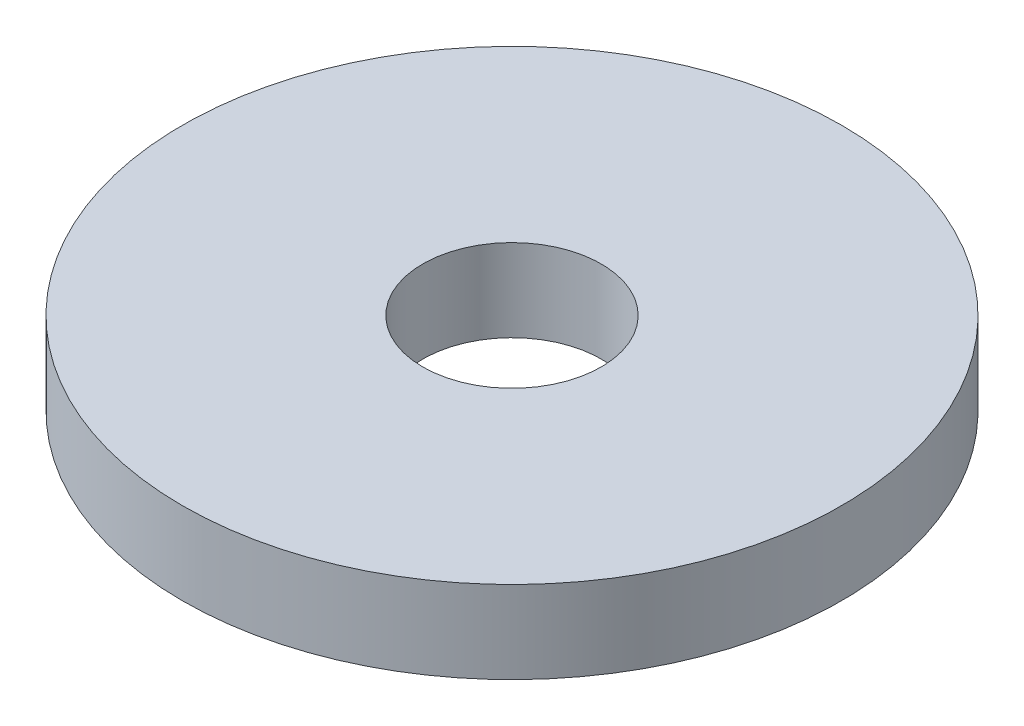
ISO-10303-21;
HEADER;
FILE_DESCRIPTION(('STEP AP214'),'2;1');
FILE_NAME('part.step','',(''),(''),'','','');
FILE_SCHEMA(('AUTOMOTIVE_DESIGN { 1 0 10303 214 1 1 1 1 }'));
ENDSEC;
DATA;
#1=APPLICATION_CONTEXT('core data for automotive mechanical design processes');
#2=APPLICATION_PROTOCOL_DEFINITION('international standard','automotive_design',2000,#1);
#3=PRODUCT_CONTEXT('',#1,'mechanical');
#4=PRODUCT('Part','Part','',(#3));
#5=PRODUCT_RELATED_PRODUCT_CATEGORY('part','',(#4));
#6=PRODUCT_DEFINITION_FORMATION('','',#4);
#7=PRODUCT_DEFINITION_CONTEXT('part definition',#1,'design');
#8=PRODUCT_DEFINITION('design','',#6,#7);
#9=PRODUCT_DEFINITION_SHAPE('','',#8);
#10=(LENGTH_UNIT() NAMED_UNIT(*) SI_UNIT(.MILLI.,.METRE.));
#11=(NAMED_UNIT(*) PLANE_ANGLE_UNIT() SI_UNIT($,.RADIAN.));
#12=(NAMED_UNIT(*) SI_UNIT($,.STERADIAN.) SOLID_ANGLE_UNIT());
#13=UNCERTAINTY_MEASURE_WITH_UNIT(LENGTH_MEASURE(1.E-05),#10,'distance_accuracy_value','');
#14=(GEOMETRIC_REPRESENTATION_CONTEXT(3) GLOBAL_UNCERTAINTY_ASSIGNED_CONTEXT((#13)) GLOBAL_UNIT_ASSIGNED_CONTEXT((#10,
#11,#12)) REPRESENTATION_CONTEXT('',''));
#15=CARTESIAN_POINT('',(0.,0.,0.));
#16=DIRECTION('',(0.,0.,1.));
#17=DIRECTION('',(1.,0.,0.));
#18=AXIS2_PLACEMENT_3D('',#15,#16,#17);
#19=CARTESIAN_POINT('',(0.,1.5,0.));
#20=DIRECTION('',(0.,1.,0.));
#21=DIRECTION('',(0.,0.,1.));
#22=AXIS2_PLACEMENT_3D('',#19,#20,#21);
#23=PLANE('',#22);
#24=CARTESIAN_POINT('',(0.,1.5,0.));
#25=DIRECTION('',(0.,1.,0.));
#26=DIRECTION('',(0.,0.,1.));
#27=AXIS2_PLACEMENT_3D('',#24,#25,#26);
#28=CIRCLE('',#27,12.);
#29=CARTESIAN_POINT('',(0.,1.5,12.));
#30=VERTEX_POINT('',#29);
#31=EDGE_CURVE('E10',#30,#30,#28,.T.);
#32=ORIENTED_EDGE('',*,*,#31,.T.);
#33=EDGE_LOOP('',(#32));
#34=FACE_BOUND('',#33,.T.);
#35=CARTESIAN_POINT('',(0.,1.5,0.));
#36=DIRECTION('',(0.,1.,0.));
#37=DIRECTION('',(0.,0.,1.));
#38=AXIS2_PLACEMENT_3D('',#35,#36,#37);
#39=CIRCLE('',#38,3.25);
#40=CARTESIAN_POINT('',(0.,1.5,3.25));
#41=VERTEX_POINT('',#40);
#42=EDGE_CURVE('E44',#41,#41,#39,.T.);
#43=ORIENTED_EDGE('',*,*,#42,.F.);
#44=EDGE_LOOP('',(#43));
#45=FACE_BOUND('',#44,.T.);
#46=ADVANCED_FACE('F33',(#34,#45),#23,.T.);
#47=CARTESIAN_POINT('',(0.,-1.5,0.));
#48=DIRECTION('',(0.,1.,0.));
#49=DIRECTION('',(0.,0.,1.));
#50=AXIS2_PLACEMENT_3D('',#47,#48,#49);
#51=PLANE('',#50);
#52=CARTESIAN_POINT('',(0.,-1.5,0.));
#53=DIRECTION('',(0.,1.,0.));
#54=DIRECTION('',(0.,0.,1.));
#55=AXIS2_PLACEMENT_3D('',#52,#53,#54);
#56=CIRCLE('',#55,12.);
#57=CARTESIAN_POINT('',(0.,-1.5,12.));
#58=VERTEX_POINT('',#57);
#59=EDGE_CURVE('E37',#58,#58,#56,.T.);
#60=ORIENTED_EDGE('',*,*,#59,.F.);
#61=EDGE_LOOP('',(#60));
#62=FACE_BOUND('',#61,.T.);
#63=CARTESIAN_POINT('',(0.,-1.5,0.));
#64=DIRECTION('',(0.,1.,0.));
#65=DIRECTION('',(0.,0.,1.));
#66=AXIS2_PLACEMENT_3D('',#63,#64,#65);
#67=CIRCLE('',#66,3.25);
#68=CARTESIAN_POINT('',(0.,-1.5,3.25));
#69=VERTEX_POINT('',#68);
#70=EDGE_CURVE('E46',#69,#69,#67,.T.);
#71=ORIENTED_EDGE('',*,*,#70,.T.);
#72=EDGE_LOOP('',(#71));
#73=FACE_BOUND('',#72,.T.);
#74=ADVANCED_FACE('F56',(#62,#73),#51,.F.);
#75=CARTESIAN_POINT('',(0.,1.5,0.));
#76=DIRECTION('',(0.,-1.,0.));
#77=DIRECTION('',(0.,0.,-1.));
#78=AXIS2_PLACEMENT_3D('',#75,#76,#77);
#79=CYLINDRICAL_SURFACE('',#78,12.);
#80=ORIENTED_EDGE('',*,*,#31,.F.);
#81=EDGE_LOOP('',(#80));
#82=FACE_BOUND('',#81,.T.);
#83=ORIENTED_EDGE('',*,*,#59,.T.);
#84=EDGE_LOOP('',(#83));
#85=FACE_BOUND('',#84,.T.);
#86=ADVANCED_FACE('F35',(#82,#85),#79,.T.);
#87=CARTESIAN_POINT('',(0.,1.5,0.));
#88=DIRECTION('',(0.,-1.,0.));
#89=DIRECTION('',(0.,0.,-1.));
#90=AXIS2_PLACEMENT_3D('',#87,#88,#89);
#91=CYLINDRICAL_SURFACE('',#90,3.25);
#92=ORIENTED_EDGE('',*,*,#42,.T.);
#93=EDGE_LOOP('',(#92));
#94=FACE_BOUND('',#93,.T.);
#95=ORIENTED_EDGE('',*,*,#70,.F.);
#96=EDGE_LOOP('',(#95));
#97=FACE_BOUND('',#96,.T.);
#98=ADVANCED_FACE('F52',(#94,#97),#91,.F.);
#99=CLOSED_SHELL('',(#46,#74,#86,#98));
#100=MANIFOLD_SOLID_BREP('B2',#99);
#101=ADVANCED_BREP_SHAPE_REPRESENTATION('',(#18,#100),#14);
#102=SHAPE_DEFINITION_REPRESENTATION(#9,#101);
ENDSEC;
END-ISO-10303-21;
